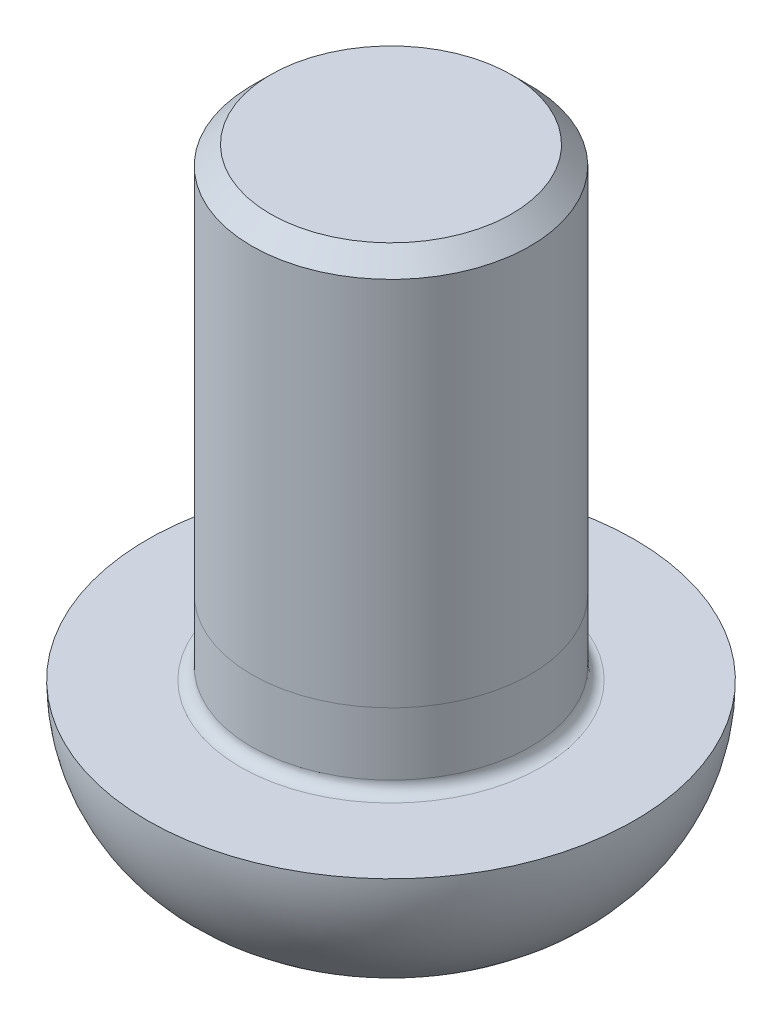
ISO-10303-21;
HEADER;
FILE_DESCRIPTION(('STEP AP214'),'2;1');
FILE_NAME('part.step','',(''),(''),'','','');
FILE_SCHEMA(('AUTOMOTIVE_DESIGN { 1 0 10303 214 1 1 1 1 }'));
ENDSEC;
DATA;
#1=APPLICATION_CONTEXT('core data for automotive mechanical design processes');
#2=APPLICATION_PROTOCOL_DEFINITION('international standard','automotive_design',2000,#1);
#3=PRODUCT_CONTEXT('',#1,'mechanical');
#4=PRODUCT('Part','Part','',(#3));
#5=PRODUCT_RELATED_PRODUCT_CATEGORY('part','',(#4));
#6=PRODUCT_DEFINITION_FORMATION('','',#4);
#7=PRODUCT_DEFINITION_CONTEXT('part definition',#1,'design');
#8=PRODUCT_DEFINITION('design','',#6,#7);
#9=PRODUCT_DEFINITION_SHAPE('','',#8);
#10=(LENGTH_UNIT() NAMED_UNIT(*) SI_UNIT(.MILLI.,.METRE.));
#11=(NAMED_UNIT(*) PLANE_ANGLE_UNIT() SI_UNIT($,.RADIAN.));
#12=(NAMED_UNIT(*) SI_UNIT($,.STERADIAN.) SOLID_ANGLE_UNIT());
#13=UNCERTAINTY_MEASURE_WITH_UNIT(LENGTH_MEASURE(1.E-05),#10,'distance_accuracy_value','');
#14=(GEOMETRIC_REPRESENTATION_CONTEXT(3) GLOBAL_UNCERTAINTY_ASSIGNED_CONTEXT((#13)) GLOBAL_UNIT_ASSIGNED_CONTEXT((#10,
#11,#12)) REPRESENTATION_CONTEXT('',''));
#15=CARTESIAN_POINT('',(0.,0.,0.));
#16=DIRECTION('',(0.,0.,1.));
#17=DIRECTION('',(1.,0.,0.));
#18=AXIS2_PLACEMENT_3D('',#15,#16,#17);
#19=CARTESIAN_POINT('',(0.,0.,0.));
#20=DIRECTION('',(0.,1.,0.));
#21=DIRECTION('',(0.,0.,1.));
#22=AXIS2_PLACEMENT_3D('',#19,#20,#21);
#23=CYLINDRICAL_SURFACE('',#22,3.);
#24=CARTESIAN_POINT('',(0.,9.6,0.));
#25=DIRECTION('',(0.,1.,0.));
#26=DIRECTION('',(0.,0.,1.));
#27=AXIS2_PLACEMENT_3D('',#24,#25,#26);
#28=CIRCLE('',#27,3.);
#29=CARTESIAN_POINT('',(0.,9.6,3.));
#30=VERTEX_POINT('',#29);
#31=EDGE_CURVE('E28',#30,#30,#28,.F.);
#32=ORIENTED_EDGE('',*,*,#31,.T.);
#33=EDGE_LOOP('',(#32));
#34=FACE_BOUND('',#33,.T.);
#35=CARTESIAN_POINT('',(0.,1.6,0.));
#36=DIRECTION('',(0.,1.,0.));
#37=DIRECTION('',(0.,0.,1.));
#38=AXIS2_PLACEMENT_3D('',#35,#36,#37);
#39=CIRCLE('',#38,3.);
#40=CARTESIAN_POINT('',(0.,1.6,3.));
#41=VERTEX_POINT('',#40);
#42=EDGE_CURVE('E11',#41,#41,#39,.T.);
#43=ORIENTED_EDGE('',*,*,#42,.T.);
#44=EDGE_LOOP('',(#43));
#45=FACE_BOUND('',#44,.T.);
#46=ADVANCED_FACE('F18',(#34,#45),#23,.T.);
#47=ORIENTED_EDGE('',*,*,#42,.F.);
#48=EDGE_LOOP('',(#47));
#49=FACE_BOUND('',#48,.T.);
#50=CARTESIAN_POINT('',(0.,0.25,0.));
#51=DIRECTION('',(0.,1.,0.));
#52=DIRECTION('',(0.,0.,1.));
#53=AXIS2_PLACEMENT_3D('',#50,#51,#52);
#54=CIRCLE('',#53,3.);
#55=CARTESIAN_POINT('',(0.,0.25,3.));
#56=VERTEX_POINT('',#55);
#57=EDGE_CURVE('E288',#56,#56,#54,.T.);
#58=ORIENTED_EDGE('',*,*,#57,.T.);
#59=EDGE_LOOP('',(#58));
#60=FACE_BOUND('',#59,.T.);
#61=ADVANCED_FACE('F201',(#49,#60),#23,.T.);
#62=CARTESIAN_POINT('',(5.25,0.,0.));
#63=DIRECTION('',(0.,1.,0.));
#64=DIRECTION('',(0.,0.,1.));
#65=AXIS2_PLACEMENT_3D('',#62,#63,#64);
#66=PLANE('',#65);
#67=CARTESIAN_POINT('',(0.,0.,0.));
#68=DIRECTION('',(0.,1.,0.));
#69=DIRECTION('',(0.,0.,1.));
#70=AXIS2_PLACEMENT_3D('',#67,#68,#69);
#71=CIRCLE('',#70,3.25);
#72=CARTESIAN_POINT('',(0.,0.,3.25));
#73=VERTEX_POINT('',#72);
#74=EDGE_CURVE('E285',#73,#73,#71,.F.);
#75=ORIENTED_EDGE('',*,*,#74,.T.);
#76=EDGE_LOOP('',(#75));
#77=FACE_BOUND('',#76,.T.);
#78=CARTESIAN_POINT('',(0.,0.,0.));
#79=DIRECTION('',(0.,1.,0.));
#80=DIRECTION('',(0.,0.,1.));
#81=AXIS2_PLACEMENT_3D('',#78,#79,#80);
#82=CIRCLE('',#81,5.25);
#83=CARTESIAN_POINT('',(0.,0.,5.25));
#84=VERTEX_POINT('',#83);
#85=EDGE_CURVE('E112',#84,#84,#82,.T.);
#86=ORIENTED_EDGE('',*,*,#85,.T.);
#87=EDGE_LOOP('',(#86));
#88=FACE_BOUND('',#87,.T.);
#89=ADVANCED_FACE('F206',(#77,#88),#66,.T.);
#90=CARTESIAN_POINT('',(0.,10.,0.));
#91=DIRECTION('',(0.,1.,0.));
#92=DIRECTION('',(0.,0.,1.));
#93=AXIS2_PLACEMENT_3D('',#90,#91,#92);
#94=PLANE('',#93);
#95=CARTESIAN_POINT('',(0.,10.,0.));
#96=DIRECTION('',(0.,1.,0.));
#97=DIRECTION('',(0.,0.,1.));
#98=AXIS2_PLACEMENT_3D('',#95,#96,#97);
#99=CIRCLE('',#98,2.6);
#100=CARTESIAN_POINT('',(0.,10.,2.6));
#101=VERTEX_POINT('',#100);
#102=EDGE_CURVE('E294',#101,#101,#99,.T.);
#103=ORIENTED_EDGE('',*,*,#102,.T.);
#104=EDGE_LOOP('',(#103));
#105=FACE_BOUND('',#104,.T.);
#106=ADVANCED_FACE('F235',(#105),#94,.T.);
#107=CARTESIAN_POINT('',(0.,0.25,0.));
#108=DIRECTION('',(0.,1.,0.));
#109=DIRECTION('',(0.,0.,1.));
#110=AXIS2_PLACEMENT_3D('',#107,#108,#109);
#111=TOROIDAL_SURFACE('',#110,3.25,0.25);
#112=ORIENTED_EDGE('',*,*,#74,.F.);
#113=EDGE_LOOP('',(#112));
#114=FACE_BOUND('',#113,.T.);
#115=ORIENTED_EDGE('',*,*,#57,.F.);
#116=EDGE_LOOP('',(#115));
#117=FACE_BOUND('',#116,.T.);
#118=ADVANCED_FACE('F274',(#114,#117),#111,.F.);
#119=CARTESIAN_POINT('',(0.,10.,0.));
#120=DIRECTION('',(0.,-1.,0.));
#121=DIRECTION('',(0.,0.,-1.));
#122=AXIS2_PLACEMENT_3D('',#119,#120,#121);
#123=CONICAL_SURFACE('',#122,2.6,0.785398163397449);
#124=ORIENTED_EDGE('',*,*,#31,.F.);
#125=EDGE_LOOP('',(#124));
#126=FACE_BOUND('',#125,.T.);
#127=ORIENTED_EDGE('',*,*,#102,.F.);
#128=EDGE_LOOP('',(#127));
#129=FACE_BOUND('',#128,.T.);
#130=ADVANCED_FACE('F21',(#126,#129),#123,.T.);
#131=CARTESIAN_POINT('',(0.,0.,0.));
#132=DIRECTION('',(0.,-1.,0.));
#133=DIRECTION('',(0.,0.,-1.));
#134=AXIS2_PLACEMENT_3D('',#131,#132,#133);
#135=DEGENERATE_TOROIDAL_SURFACE('',#134,1.67165208586472,3.57834791413527,.T.);
#136=ORIENTED_EDGE('',*,*,#85,.F.);
#137=EDGE_LOOP('',(#136));
#138=FACE_BOUND('',#137,.T.);
#139=CARTESIAN_POINT('',(0.,-3.3,0.));
#140=DIRECTION('',(0.,-1.,0.));
#141=DIRECTION('',(0.,0.,-1.));
#142=AXIS2_PLACEMENT_3D('',#139,#140,#141);
#143=CIRCLE('',#142,3.05533333333333);
#144=CARTESIAN_POINT('',(0.,-3.3,-3.05533333333333));
#145=VERTEX_POINT('',#144);
#146=EDGE_CURVE('E128',#145,#145,#143,.T.);
#147=ORIENTED_EDGE('',*,*,#146,.F.);
#148=EDGE_LOOP('',(#147));
#149=FACE_BOUND('',#148,.T.);
#150=ADVANCED_FACE('F153',(#138,#149),#135,.T.);
#151=CARTESIAN_POINT('',(0.,0.391673276442843,0.));
#152=DIRECTION('',(0.,-1.,0.));
#153=DIRECTION('',(0.,0.,-1.));
#154=AXIS2_PLACEMENT_3D('',#151,#152,#153);
#155=CONICAL_SURFACE('',#154,0.,1.0471975511966);
#156=CARTESIAN_POINT('',(0.,0.391673276442843,0.));
#157=VERTEX_POINT('',#156);
#158=VERTEX_LOOP('',#157);
#159=FACE_BOUND('',#158,.T.);
#160=CARTESIAN_POINT('',(-1.15458506832542,-0.94172672855691,2.0002));
#161=CARTESIAN_POINT('',(-1.20532911262018,-0.91241679803709,1.91230873709994));
#162=CARTESIAN_POINT('',(-1.2565111744778,-0.885760113916877,1.82365880552641));
#163=CARTESIAN_POINT('',(-1.3597616401932,-0.839229752957131,1.6448237530022));
#164=CARTESIAN_POINT('',(-1.41183187919146,-0.819372538319189,1.55463545349496));
#165=CARTESIAN_POINT('',(-1.51532701829184,-0.788460725959663,1.37537661423669));
#166=CARTESIAN_POINT('',(-1.56673599086579,-0.777200413534941,1.28633366177369));
#167=CARTESIAN_POINT('',(-1.66979593505374,-0.763755924531053,1.10782860221495));
#168=CARTESIAN_POINT('',(-1.72144653186531,-0.76156061688988,1.01836714429604));
#169=CARTESIAN_POINT('',(-1.81796535054794,-0.766118251267061,0.851191646451196));
#170=CARTESIAN_POINT('',(-1.86284799277603,-0.771752136623426,0.773452629734213));
#171=CARTESIAN_POINT('',(-1.95232085557725,-0.789611157197239,0.618481085463865));
#172=CARTESIAN_POINT('',(-1.99691076648955,-0.80184239795985,0.5412490942588));
#173=CARTESIAN_POINT('',(-2.08656822922817,-0.832420698804021,0.385957813517798));
#174=CARTESIAN_POINT('',(-2.13162442866767,-0.850897429002127,0.30791818689262));
#175=CARTESIAN_POINT('',(-2.221064675979,-0.892832780149267,0.153003134307866));
#176=CARTESIAN_POINT('',(-2.26544987045196,-0.916281542428725,0.0761257223768806));
#177=CARTESIAN_POINT('',(-2.30951654681234,-0.941726728556909,-0.000200000000000504));
#178=B_SPLINE_CURVE_WITH_KNOTS('',3,(#160,#161,#162,#163,#164,#165,#166,#167,#168,#169,#170,
#171,#172,#173,#174,#175,#176,#177),.UNSPECIFIED.,.F.,.F.,(4,2,2,2,2,2,2,2,4),(0.,
0.317031824695612,0.634825876346566,0.944753967652639,1.25430138000372,1.52387047293094,
1.79368946861028,2.06949491027634,2.34475850821472),.UNSPECIFIED.);
#179=CARTESIAN_POINT('',(-1.15470053837926,-0.941660056890493,2.));
#180=VERTEX_POINT('',#179);
#181=CARTESIAN_POINT('',(-2.3094010767585,-0.941660056890492,0.));
#182=VERTEX_POINT('',#181);
#183=EDGE_CURVE('E239',#180,#182,#178,.T.);
#184=ORIENTED_EDGE('',*,*,#183,.T.);
#185=CARTESIAN_POINT('',(-2.30951654681234,-0.941726728556909,0.000200000000000068));
#186=CARTESIAN_POINT('',(-2.25877250251757,-0.912416798037087,-0.0876912629000592));
#187=CARTESIAN_POINT('',(-2.20759044065995,-0.885760113916874,-0.17634119447359));
#188=CARTESIAN_POINT('',(-2.10433997494456,-0.839229752957128,-0.355176246997801));
#189=CARTESIAN_POINT('',(-2.0522697359463,-0.819372538319187,-0.445364546505036));
#190=CARTESIAN_POINT('',(-1.94877459684592,-0.78846072595966,-0.624623385763305));
#191=CARTESIAN_POINT('',(-1.89736562427197,-0.777200413534938,-0.713666338226303));
#192=CARTESIAN_POINT('',(-1.79430568008402,-0.76375592453105,-0.892171397785043));
#193=CARTESIAN_POINT('',(-1.74265508327244,-0.761560616889878,-0.981632855703958));
#194=CARTESIAN_POINT('',(-1.64613626458981,-0.766118251267059,-1.1488083535488));
#195=CARTESIAN_POINT('',(-1.60125362236172,-0.771752136623423,-1.22654737026578));
#196=CARTESIAN_POINT('',(-1.5117807595605,-0.789611157197236,-1.38151891453613));
#197=CARTESIAN_POINT('',(-1.46719084864821,-0.801842397959847,-1.4587509057412));
#198=CARTESIAN_POINT('',(-1.37753338590959,-0.832420698804018,-1.6140421864822));
#199=CARTESIAN_POINT('',(-1.33247718647008,-0.850897429002124,-1.69208181310738));
#200=CARTESIAN_POINT('',(-1.24303693915875,-0.892832780149265,-1.84699686569214));
#201=CARTESIAN_POINT('',(-1.19865174468579,-0.916281542428723,-1.92387427762312));
#202=CARTESIAN_POINT('',(-1.15458506832541,-0.94172672855691,-2.0002));
#203=B_SPLINE_CURVE_WITH_KNOTS('',3,(#185,#186,#187,#188,#189,#190,#191,#192,#193,#194,#195,
#196,#197,#198,#199,#200,#201,#202),.UNSPECIFIED.,.F.,.F.,(4,2,2,2,2,2,2,2,4),(0.,
0.317031824695611,0.634825876346565,0.944753967652637,1.25430138000371,1.52387047293094,
1.79368946861029,2.06949491027634,2.34475850821473),.UNSPECIFIED.);
#204=CARTESIAN_POINT('',(-1.15470053837925,-0.941660056890493,-2.));
#205=VERTEX_POINT('',#204);
#206=EDGE_CURVE('E217',#182,#205,#203,.T.);
#207=ORIENTED_EDGE('',*,*,#206,.T.);
#208=CARTESIAN_POINT('',(-3.97107242292986,-2.17538835040825,-2.));
#209=CARTESIAN_POINT('',(-3.87868247277526,-2.12775059746127,-2.));
#210=CARTESIAN_POINT('',(-3.7861588003778,-2.08037372958414,-2.));
#211=CARTESIAN_POINT('',(-3.60078450821548,-1.98626017948102,-2.00000000000001));
#212=CARTESIAN_POINT('',(-3.50793388259158,-1.93952350880157,-2.00000000000001));
#213=CARTESIAN_POINT('',(-3.22850900761148,-1.80030535880982,-2.));
#214=CARTESIAN_POINT('',(-3.04135761037277,-1.70896924768975,-2.));
#215=CARTESIAN_POINT('',(-2.75397555619272,-1.5731154540905,-2.));
#216=CARTESIAN_POINT('',(-2.65454530475032,-1.52690595800733,-2.));
#217=CARTESIAN_POINT('',(-2.45492785759602,-1.43615536855376,-2.));
#218=CARTESIAN_POINT('',(-2.3547406899451,-1.39161421369455,-2.));
#219=CARTESIAN_POINT('',(-2.15350213975009,-1.30470652650298,-2.));
#220=CARTESIAN_POINT('',(-2.05245137959688,-1.26233856057289,-2.));
#221=CARTESIAN_POINT('',(-1.84919030086332,-1.18039650371769,-2.));
#222=CARTESIAN_POINT('',(-1.74697972173689,-1.14082305558609,-2.));
#223=CARTESIAN_POINT('',(-1.52508206994959,-1.05946514421621,-2.));
#224=CARTESIAN_POINT('',(-1.40516322629618,-1.01830385306277,-2.));
#225=CARTESIAN_POINT('',(-1.16321218809007,-0.942832074454553,-2.));
#226=CARTESIAN_POINT('',(-1.04118108489843,-0.908518157540933,-2.));
#227=CARTESIAN_POINT('',(-0.797191699347654,-0.849762632395411,-2.));
#228=CARTESIAN_POINT('',(-0.675277439673617,-0.825143320410585,-2.));
#229=CARTESIAN_POINT('',(-0.42968597996561,-0.78740551194056,-2.));
#230=CARTESIAN_POINT('',(-0.306009864773069,-0.774280224898857,-2.));
#231=CARTESIAN_POINT('',(-0.0561948130021474,-0.761222818220792,-2.));
#232=CARTESIAN_POINT('',(0.0699543957642671,-0.761477523372083,-2.));
#233=CARTESIAN_POINT('',(0.321490472578919,-0.775609005131668,-2.));
#234=CARTESIAN_POINT('',(0.446877078128915,-0.789490231676833,-2.));
#235=CARTESIAN_POINT('',(0.698268076239721,-0.829339251040338,-2.));
#236=CARTESIAN_POINT('',(0.824232704616094,-0.855548309192251,-1.99999999999999));
#237=CARTESIAN_POINT('',(1.07382197335698,-0.917314019236256,-2.));
#238=CARTESIAN_POINT('',(1.19744582529425,-0.952873762658447,-2.));
#239=CARTESIAN_POINT('',(1.43877717975325,-1.02962266424125,-2.));
#240=CARTESIAN_POINT('',(1.55655051066925,-1.07060890554915,-2.));
#241=CARTESIAN_POINT('',(1.79038315988528,-1.15724391469459,-1.99999999999999));
#242=CARTESIAN_POINT('',(1.90644203337208,-1.20289386902531,-1.99999999999999));
#243=CARTESIAN_POINT('',(2.13727613898438,-1.29764227315016,-1.99999999999999));
#244=CARTESIAN_POINT('',(2.25204987258198,-1.3467443434052,-1.99999999999999));
#245=CARTESIAN_POINT('',(2.48048565996255,-1.44747310577301,-1.99999999999999));
#246=CARTESIAN_POINT('',(2.59414765093807,-1.499099939544,-1.99999999999999));
#247=CARTESIAN_POINT('',(2.81406706680889,-1.60122748447267,-1.99999999999999));
#248=CARTESIAN_POINT('',(2.92037405177845,-1.65162191070667,-1.99999999999999));
#249=CARTESIAN_POINT('',(3.1323563665145,-1.75372845058398,-1.99999999999999));
#250=CARTESIAN_POINT('',(3.23803167473215,-1.80544060886685,-1.99999999999999));
#251=CARTESIAN_POINT('',(3.44851064882037,-1.90972549113419,-1.99999999999999));
#252=CARTESIAN_POINT('',(3.55331605390046,-1.96229471304186,-1.99999999999999));
#253=CARTESIAN_POINT('',(3.7624942913087,-2.06826501338616,-1.99999999999999));
#254=CARTESIAN_POINT('',(3.86686716058578,-2.12166601883339,-1.99999999999999));
#255=CARTESIAN_POINT('',(3.97107242292986,-2.17538835040825,-2.));
#256=B_SPLINE_CURVE_WITH_KNOTS('',3,(#208,#209,#210,#211,#212,#213,#214,#215,#216,#217,#218,
#219,#220,#221,#222,#223,#224,#225,#226,#227,#228,#229,#230,#231,#232,#233,#234,#235,#236,#237,
#238,#239,#240,#241,#242,#243,#244,#245,#246,#247,#248,#249,#250,#251,#252,#253,#254,#255),
.UNSPECIFIED.,.F.,.F.,(4,2,2,2,2,2,2,2,2,2,2,2,2,2,2,2,2,2,2,2,2,2,2,4),(0.,0.311842723826934,
0.62369106463389,1.24838758455579,1.57730682351192,1.90621392778465,2.23490119378745,
2.56366381964157,2.94387628317646,3.32389783939494,3.69658721194995,4.06905625447051,
4.44672744508521,4.82452201071132,5.21003920255201,5.59568401496473,5.96965872681082,
6.34372881945369,6.71819725104189,7.09268671728378,7.44561614609446,7.79855754669429,
8.15030525169476,8.50202226264185),.UNSPECIFIED.);
#257=CARTESIAN_POINT('',(1.15470053837925,-0.941660056890493,-2.));
#258=VERTEX_POINT('',#257);
#259=EDGE_CURVE('E109',#205,#258,#256,.T.);
#260=ORIENTED_EDGE('',*,*,#259,.T.);
#261=CARTESIAN_POINT('',(1.15458506832542,-0.941726728556909,-2.0002));
#262=CARTESIAN_POINT('',(1.20532911262018,-0.912416798037089,-1.91230873709994));
#263=CARTESIAN_POINT('',(1.2565111744778,-0.885760113916877,-1.82365880552641));
#264=CARTESIAN_POINT('',(1.3597616401932,-0.839229752957131,-1.6448237530022));
#265=CARTESIAN_POINT('',(1.41183187919145,-0.819372538319189,-1.55463545349496));
#266=CARTESIAN_POINT('',(1.51532701829183,-0.788460725959662,-1.37537661423669));
#267=CARTESIAN_POINT('',(1.56673599086579,-0.777200413534941,-1.2863336617737));
#268=CARTESIAN_POINT('',(1.66979593505373,-0.763755924531052,-1.10782860221496));
#269=CARTESIAN_POINT('',(1.72144653186531,-0.761560616889878,-1.01836714429604));
#270=CARTESIAN_POINT('',(1.81796535054794,-0.766118251267059,-0.851191646451198));
#271=CARTESIAN_POINT('',(1.86284799277603,-0.771752136623424,-0.773452629734215));
#272=CARTESIAN_POINT('',(1.95232085557725,-0.789611157197239,-0.618481085463866));
#273=CARTESIAN_POINT('',(1.99691076648955,-0.80184239795985,-0.5412490942588));
#274=CARTESIAN_POINT('',(2.08656822922816,-0.832420698804021,-0.385957813517798));
#275=CARTESIAN_POINT('',(2.13162442866767,-0.850897429002127,-0.307918186892619));
#276=CARTESIAN_POINT('',(2.221064675979,-0.892832780149267,-0.153003134307863));
#277=CARTESIAN_POINT('',(2.26544987045196,-0.916281542428725,-0.0761257223768776));
#278=CARTESIAN_POINT('',(2.30951654681234,-0.941726728556909,0.000200000000003825));
#279=B_SPLINE_CURVE_WITH_KNOTS('',3,(#261,#262,#263,#264,#265,#266,#267,#268,#269,#270,#271,
#272,#273,#274,#275,#276,#277,#278),.UNSPECIFIED.,.F.,.F.,(4,2,2,2,2,2,2,2,4),(0.,
0.31703182469561,0.634825876346565,0.944753967652637,1.25430138000371,1.52387047293094,
1.79368946861028,2.06949491027634,2.34475850821473),.UNSPECIFIED.);
#280=CARTESIAN_POINT('',(2.3094010767585,-0.941660056890493,0.));
#281=VERTEX_POINT('',#280);
#282=EDGE_CURVE('E263',#258,#281,#279,.T.);
#283=ORIENTED_EDGE('',*,*,#282,.T.);
#284=CARTESIAN_POINT('',(2.30951654681234,-0.941726728556909,-0.000199999999996057));
#285=CARTESIAN_POINT('',(2.25877250251757,-0.912416798037088,0.0876912629000633));
#286=CARTESIAN_POINT('',(2.20759044065995,-0.885760113916875,0.176341194473594));
#287=CARTESIAN_POINT('',(2.10433997494456,-0.839229752957129,0.355176246997805));
#288=CARTESIAN_POINT('',(2.0522697359463,-0.819372538319187,0.445364546505039));
#289=CARTESIAN_POINT('',(1.94877459684592,-0.78846072595966,0.624623385763309));
#290=CARTESIAN_POINT('',(1.89736562427197,-0.777200413534938,0.713666338226308));
#291=CARTESIAN_POINT('',(1.79430568008402,-0.76375592453105,0.892171397785046));
#292=CARTESIAN_POINT('',(1.74265508327243,-0.761560616889878,0.98163285570396));
#293=CARTESIAN_POINT('',(1.64613626458981,-0.766118251267059,1.1488083535488));
#294=CARTESIAN_POINT('',(1.60125362236172,-0.771752136623423,1.22654737026579));
#295=CARTESIAN_POINT('',(1.5117807595605,-0.789611157197236,1.38151891453614));
#296=CARTESIAN_POINT('',(1.46719084864821,-0.801842397959848,1.4587509057412));
#297=CARTESIAN_POINT('',(1.37753338590959,-0.832420698804018,1.6140421864822));
#298=CARTESIAN_POINT('',(1.33247718647008,-0.850897429002125,1.69208181310738));
#299=CARTESIAN_POINT('',(1.24303693915875,-0.892832780149265,1.84699686569214));
#300=CARTESIAN_POINT('',(1.19865174468579,-0.916281542428723,1.92387427762312));
#301=CARTESIAN_POINT('',(1.1545850683254,-0.941726728556909,2.0002));
#302=B_SPLINE_CURVE_WITH_KNOTS('',3,(#284,#285,#286,#287,#288,#289,#290,#291,#292,#293,#294,
#295,#296,#297,#298,#299,#300,#301),.UNSPECIFIED.,.F.,.F.,(4,2,2,2,2,2,2,2,4),(0.,
0.317031824695611,0.634825876346565,0.944753967652638,1.25430138000371,1.52387047293094,
1.79368946861028,2.06949491027634,2.34475850821473),.UNSPECIFIED.);
#303=CARTESIAN_POINT('',(1.15470053837924,-0.941660056890492,2.));
#304=VERTEX_POINT('',#303);
#305=EDGE_CURVE('E257',#281,#304,#302,.T.);
#306=ORIENTED_EDGE('',*,*,#305,.T.);
#307=CARTESIAN_POINT('',(3.97107242292986,-2.17538835040825,2.));
#308=CARTESIAN_POINT('',(3.87868247277525,-2.12775059746126,2.));
#309=CARTESIAN_POINT('',(3.7861588003778,-2.08037372958414,2.00000000000001));
#310=CARTESIAN_POINT('',(3.60078450821547,-1.98626017948102,2.00000000000001));
#311=CARTESIAN_POINT('',(3.50793388259158,-1.93952350880157,2.00000000000001));
#312=CARTESIAN_POINT('',(3.22850900761148,-1.80030535880982,2.));
#313=CARTESIAN_POINT('',(3.04135761037276,-1.70896924768974,2.));
#314=CARTESIAN_POINT('',(2.75397555619272,-1.5731154540905,2.));
#315=CARTESIAN_POINT('',(2.65454530475031,-1.52690595800733,2.));
#316=CARTESIAN_POINT('',(2.45492785759602,-1.43615536855376,2.));
#317=CARTESIAN_POINT('',(2.35474068994509,-1.39161421369454,2.));
#318=CARTESIAN_POINT('',(2.15350213975008,-1.30470652650297,2.));
#319=CARTESIAN_POINT('',(2.05245137959687,-1.26233856057289,2.));
#320=CARTESIAN_POINT('',(1.84919030086332,-1.18039650371768,2.));
#321=CARTESIAN_POINT('',(1.74697972173688,-1.14082305558609,2.));
#322=CARTESIAN_POINT('',(1.52508206994959,-1.05946514421621,2.));
#323=CARTESIAN_POINT('',(1.40516322629617,-1.01830385306277,2.));
#324=CARTESIAN_POINT('',(1.16321218809006,-0.942832074454551,2.));
#325=CARTESIAN_POINT('',(1.04118108489842,-0.90851815754093,2.));
#326=CARTESIAN_POINT('',(0.797191699347647,-0.849762632395409,2.));
#327=CARTESIAN_POINT('',(0.675277439673609,-0.825143320410583,2.));
#328=CARTESIAN_POINT('',(0.429685979965601,-0.787405511940558,2.));
#329=CARTESIAN_POINT('',(0.30600986477306,-0.774280224898856,2.));
#330=CARTESIAN_POINT('',(0.0561948130021376,-0.761222818220792,2.));
#331=CARTESIAN_POINT('',(-0.0699543957642771,-0.761477523372083,2.));
#332=CARTESIAN_POINT('',(-0.32149047257893,-0.775609005131668,2.));
#333=CARTESIAN_POINT('',(-0.446877078128926,-0.789490231676834,2.));
#334=CARTESIAN_POINT('',(-0.698268076239732,-0.82933925104034,2.));
#335=CARTESIAN_POINT('',(-0.824232704616105,-0.855548309192252,1.99999999999999));
#336=CARTESIAN_POINT('',(-1.07382197335699,-0.917314019236258,2.));
#337=CARTESIAN_POINT('',(-1.19744582529427,-0.95287376265845,2.));
#338=CARTESIAN_POINT('',(-1.43877717975326,-1.02962266424125,2.));
#339=CARTESIAN_POINT('',(-1.55655051066926,-1.07060890554915,1.99999999999999));
#340=CARTESIAN_POINT('',(-1.79038315988529,-1.15724391469459,1.99999999999999));
#341=CARTESIAN_POINT('',(-1.90644203337209,-1.20289386902531,1.99999999999999));
#342=CARTESIAN_POINT('',(-2.13727613898438,-1.29764227315017,1.99999999999999));
#343=CARTESIAN_POINT('',(-2.25204987258199,-1.3467443434052,1.99999999999999));
#344=CARTESIAN_POINT('',(-2.48048565996256,-1.44747310577301,1.99999999999999));
#345=CARTESIAN_POINT('',(-2.59414765093807,-1.499099939544,1.99999999999999));
#346=CARTESIAN_POINT('',(-2.81406706680889,-1.60122748447267,1.99999999999999));
#347=CARTESIAN_POINT('',(-2.92037405177846,-1.65162191070667,1.99999999999999));
#348=CARTESIAN_POINT('',(-3.1323563665145,-1.75372845058398,1.99999999999999));
#349=CARTESIAN_POINT('',(-3.23803167473215,-1.80544060886684,1.99999999999999));
#350=CARTESIAN_POINT('',(-3.44851064882038,-1.90972549113419,1.99999999999999));
#351=CARTESIAN_POINT('',(-3.55331605390046,-1.96229471304186,1.99999999999999));
#352=CARTESIAN_POINT('',(-3.7624942913087,-2.06826501338616,1.99999999999999));
#353=CARTESIAN_POINT('',(-3.86686716058578,-2.12166601883338,1.99999999999999));
#354=CARTESIAN_POINT('',(-3.97107242292986,-2.17538835040825,2.));
#355=B_SPLINE_CURVE_WITH_KNOTS('',3,(#307,#308,#309,#310,#311,#312,#313,#314,#315,#316,#317,
#318,#319,#320,#321,#322,#323,#324,#325,#326,#327,#328,#329,#330,#331,#332,#333,#334,#335,#336,
#337,#338,#339,#340,#341,#342,#343,#344,#345,#346,#347,#348,#349,#350,#351,#352,#353,#354),
.UNSPECIFIED.,.F.,.F.,(4,2,2,2,2,2,2,2,2,2,2,2,2,2,2,2,2,2,2,2,2,2,2,4),(0.,0.311842723826934,
0.623691064633889,1.24838758455579,1.57730682351192,1.90621392778465,2.23490119378744,
2.56366381964157,2.94387628317646,3.32389783939494,3.69658721194995,4.06905625447051,
4.44672744508521,4.82452201071133,5.21003920255201,5.59568401496474,5.96965872681082,
6.34372881945369,6.71819725104189,7.09268671728378,7.44561614609446,7.79855754669429,
8.15030525169475,8.50202226264184),.UNSPECIFIED.);
#356=EDGE_CURVE('E249',#304,#180,#355,.T.);
#357=ORIENTED_EDGE('',*,*,#356,.T.);
#358=EDGE_LOOP('',(#184,#207,#260,#283,#306,#357));
#359=FACE_BOUND('',#358,.T.);
#360=ADVANCED_FACE('F186',(#159,#359),#155,.F.);
#361=CARTESIAN_POINT('',(-1.15470053837925,16.6346432122574,-2.));
#362=DIRECTION('',(0.,0.,-1.));
#363=DIRECTION('',(-1.,0.,0.));
#364=AXIS2_PLACEMENT_3D('',#361,#362,#363);
#365=PLANE('',#364);
#366=CARTESIAN_POINT('',(3.54576846416073,-3.77200034906827,-2.));
#367=CARTESIAN_POINT('',(3.46032331155691,-3.75206057830072,-1.99999999999999));
#368=CARTESIAN_POINT('',(3.37484047761441,-3.73228232054218,-1.99999999999999));
#369=CARTESIAN_POINT('',(3.20378355240315,-3.69311847013324,-1.99999999999999));
#370=CARTESIAN_POINT('',(3.11820945972395,-3.67373288364707,-1.99999999999999));
#371=CARTESIAN_POINT('',(2.86130062428642,-3.61626384835692,-1.99999999999999));
#372=CARTESIAN_POINT('',(2.68980910024909,-3.57887512354549,-1.99999999999999));
#373=CARTESIAN_POINT('',(2.34458511529228,-3.50643853365192,-1.99999999999999));
#374=CARTESIAN_POINT('',(2.1708470844132,-3.47141698135254,-1.99999999999999));
#375=CARTESIAN_POINT('',(1.82256095831907,-3.40547978469486,-1.99999999999999));
#376=CARTESIAN_POINT('',(1.64801278540453,-3.37456454295519,-1.99999999999999));
#377=CARTESIAN_POINT('',(1.30271990845848,-3.31969790886641,-1.99999999999999));
#378=CARTESIAN_POINT('',(1.13200256296387,-3.29557843402185,-2.));
#379=CARTESIAN_POINT('',(0.789571689000483,-3.25587323584062,-2.));
#380=CARTESIAN_POINT('',(0.6178584998347,-3.24028476073478,-2.));
#381=CARTESIAN_POINT('',(0.36019540394543,-3.22525401912313,-2.));
#382=CARTESIAN_POINT('',(0.274483715684513,-3.22163460627376,-2.));
#383=CARTESIAN_POINT('',(0.102984480205782,-3.21731952917178,-2.));
#384=CARTESIAN_POINT('',(0.0171969334570651,-3.21662384696397,-2.));
#385=CARTESIAN_POINT('',(-0.15435587366281,-3.21819853237707,-2.));
#386=CARTESIAN_POINT('',(-0.240121132206929,-3.22046909420923,-2.));
#387=CARTESIAN_POINT('',(-0.411526390365097,-3.22785312413437,-2.));
#388=CARTESIAN_POINT('',(-0.497166389972947,-3.23296659236802,-2.));
#389=CARTESIAN_POINT('',(-0.706478859815856,-3.24865578967162,-2.));
#390=CARTESIAN_POINT('',(-0.830044925850673,-3.26065132303124,-2.));
#391=CARTESIAN_POINT('',(-1.07664653209346,-3.28907898341361,-2.));
#392=CARTESIAN_POINT('',(-1.19968208520209,-3.30551100192753,-2.));
#393=CARTESIAN_POINT('',(-1.44564714901042,-3.34186148211041,-2.));
#394=CARTESIAN_POINT('',(-1.5685749476794,-3.36179135163048,-2.));
#395=CARTESIAN_POINT('',(-1.81398159923811,-3.40425123821713,-2.));
#396=CARTESIAN_POINT('',(-1.93646042849967,-3.42678139015956,-2.));
#397=CARTESIAN_POINT('',(-2.18362417007064,-3.47428425653496,-2.));
#398=CARTESIAN_POINT('',(-2.30830103623406,-3.49929851142906,-2.));
#399=CARTESIAN_POINT('',(-2.55733999903382,-3.55084664791934,-2.));
#400=CARTESIAN_POINT('',(-2.68170209177125,-3.57738054824321,-2.));
#401=CARTESIAN_POINT('',(-2.92946437432295,-3.6314395789905,-2.));
#402=CARTESIAN_POINT('',(-3.05286599737638,-3.65895817166457,-2.));
#403=CARTESIAN_POINT('',(-3.29945995688185,-3.71487849715073,-2.));
#404=CARTESIAN_POINT('',(-3.4226523077504,-3.74328016629155,-2.));
#405=CARTESIAN_POINT('',(-3.54576846416072,-3.77200034906825,-2.));
#406=B_SPLINE_CURVE_WITH_KNOTS('',3,(#366,#367,#368,#369,#370,#371,#372,#373,#374,#375,#376,
#377,#378,#379,#380,#381,#382,#383,#384,#385,#386,#387,#388,#389,#390,#391,#392,#393,#394,#395,
#396,#397,#398,#399,#400,#401,#402,#403,#404,#405),.UNSPECIFIED.,.F.,.F.,(4,2,2,2,2,2,2,2,2,2,2,
2,2,2,2,2,2,2,2,4),(0.,0.263222401305707,0.526448931537519,1.05299375162049,1.58466125538442,
2.11638085006353,2.63348257137836,3.15041739730247,3.40773776741521,3.66505655727231,
3.92239219561216,4.17972784668617,4.55206097335712,4.92438499422329,5.29794667206535,
5.67152773515151,6.05299963584967,6.434476238713,6.81377086422973,7.1930382051055),.UNSPECIFIED.);
#407=CARTESIAN_POINT('',(1.15470053837925,-3.3,-2.));
#408=VERTEX_POINT('',#407);
#409=CARTESIAN_POINT('',(-1.15470053837925,-3.3,-2.));
#410=VERTEX_POINT('',#409);
#411=EDGE_CURVE('E88',#408,#410,#406,.T.);
#412=ORIENTED_EDGE('',*,*,#411,.F.);
#413=DIRECTION('',(0.,-1.,0.));
#414=VECTOR('',#413,1.);
#415=CARTESIAN_POINT('',(1.15470053837925,16.6346432122574,-2.));
#416=LINE('',#415,#414);
#417=EDGE_CURVE('E113',#258,#408,#416,.T.);
#418=ORIENTED_EDGE('',*,*,#417,.F.);
#419=ORIENTED_EDGE('',*,*,#259,.F.);
#420=DIRECTION('',(0.,-1.,0.));
#421=VECTOR('',#420,1.);
#422=CARTESIAN_POINT('',(-1.15470053837925,16.6346432122574,-2.));
#423=LINE('',#422,#421);
#424=EDGE_CURVE('E101',#205,#410,#423,.T.);
#425=ORIENTED_EDGE('',*,*,#424,.T.);
#426=EDGE_LOOP('',(#412,#418,#419,#425));
#427=FACE_BOUND('',#426,.T.);
#428=ADVANCED_FACE('F107',(#427),#365,.F.);
#429=CARTESIAN_POINT('',(1.15470053837925,16.6346432122574,-2.));
#430=DIRECTION('',(0.866025403784439,0.,-0.5));
#431=DIRECTION('',(-0.5,0.,-0.86602540378444));
#432=AXIS2_PLACEMENT_3D('',#429,#430,#431);
#433=PLANE('',#432);
#434=CARTESIAN_POINT('',(2.30951654681234,-3.30003094242808,0.000200000000003903));
#435=CARTESIAN_POINT('',(2.26155517902373,-3.28717294728116,-0.0828715258103692));
#436=CARTESIAN_POINT('',(2.21350683851658,-3.27549990930549,-0.166093692788128));
#437=CARTESIAN_POINT('',(2.11724043254796,-3.25499135519067,-0.332831998987827));
#438=CARTESIAN_POINT('',(2.06902230613691,-3.24615699216786,-0.416348243777553));
#439=CARTESIAN_POINT('',(1.97270874423801,-3.231841640157,-0.58316822644438));
#440=CARTESIAN_POINT('',(1.92461396034488,-3.22634357564339,-0.666470835726323));
#441=CARTESIAN_POINT('',(1.8283630443694,-3.21897122197136,-0.833182312470901));
#442=CARTESIAN_POINT('',(1.78020692596914,-3.21709623134525,-0.91659115623545));
#443=CARTESIAN_POINT('',(1.68389468916862,-3.21709623134525,-1.08340884376455));
#444=CARTESIAN_POINT('',(1.63573857076836,-3.21897122197136,-1.1668176875291));
#445=CARTESIAN_POINT('',(1.53948765479288,-3.22634357564339,-1.33352916427368));
#446=CARTESIAN_POINT('',(1.49139287089975,-3.231841640157,-1.41683177355562));
#447=CARTESIAN_POINT('',(1.39507930900085,-3.24615699216786,-1.58365175622245));
#448=CARTESIAN_POINT('',(1.3468611825898,-3.25499135519067,-1.66716800101217));
#449=CARTESIAN_POINT('',(1.25059477662118,-3.27549990930549,-1.83390630721187));
#450=CARTESIAN_POINT('',(1.20254643611403,-3.28717294728116,-1.91712847418963));
#451=CARTESIAN_POINT('',(1.15458506832542,-3.30003094242808,-2.0002));
#452=B_SPLINE_CURVE_WITH_KNOTS('',3,(#434,#435,#436,#437,#438,#439,#440,#441,#442,#443,#444,
#445,#446,#447,#448,#449,#450,#451),.UNSPECIFIED.,.F.,.F.,(4,2,2,2,2,2,2,2,4),(0.,
0.290357249044671,0.580832297293914,0.869807841095771,1.15872743038697,1.44764701967818,
1.73662256348003,2.02709761172928,2.31745486077395),.UNSPECIFIED.);
#453=CARTESIAN_POINT('',(2.30940107675851,-3.3,0.));
#454=VERTEX_POINT('',#453);
#455=EDGE_CURVE('E96',#454,#408,#452,.T.);
#456=ORIENTED_EDGE('',*,*,#455,.F.);
#457=DIRECTION('',(0.,-1.,0.));
#458=VECTOR('',#457,1.);
#459=CARTESIAN_POINT('',(2.3094010767585,16.6346432122574,0.));
#460=LINE('',#459,#458);
#461=EDGE_CURVE('E318',#281,#454,#460,.T.);
#462=ORIENTED_EDGE('',*,*,#461,.F.);
#463=ORIENTED_EDGE('',*,*,#282,.F.);
#464=ORIENTED_EDGE('',*,*,#417,.T.);
#465=EDGE_LOOP('',(#456,#462,#463,#464));
#466=FACE_BOUND('',#465,.T.);
#467=ADVANCED_FACE('F185',(#466),#433,.F.);
#468=CARTESIAN_POINT('',(2.3094010767585,16.6346432122574,0.));
#469=DIRECTION('',(0.866025403784437,0.,0.5));
#470=DIRECTION('',(0.5,0.,-0.866025403784438));
#471=AXIS2_PLACEMENT_3D('',#468,#469,#470);
#472=PLANE('',#471);
#473=CARTESIAN_POINT('',(1.1545850683254,-3.30003094242808,2.0002));
#474=CARTESIAN_POINT('',(1.20254643611402,-3.28717294728116,1.91712847418963));
#475=CARTESIAN_POINT('',(1.25059477662117,-3.27549990930549,1.83390630721187));
#476=CARTESIAN_POINT('',(1.34686118258979,-3.25499135519067,1.66716800101217));
#477=CARTESIAN_POINT('',(1.39507930900085,-3.24615699216786,1.58365175622245));
#478=CARTESIAN_POINT('',(1.49139287089975,-3.231841640157,1.41683177355562));
#479=CARTESIAN_POINT('',(1.53948765479288,-3.22634357564339,1.33352916427368));
#480=CARTESIAN_POINT('',(1.63573857076836,-3.21897122197136,1.1668176875291));
#481=CARTESIAN_POINT('',(1.68389468916862,-3.21709623134525,1.08340884376455));
#482=CARTESIAN_POINT('',(1.78020692596913,-3.21709623134525,0.916591156235454));
#483=CARTESIAN_POINT('',(1.82836304436939,-3.21897122197136,0.833182312470905));
#484=CARTESIAN_POINT('',(1.92461396034487,-3.22634357564339,0.666470835726328));
#485=CARTESIAN_POINT('',(1.972708744238,-3.231841640157,0.583168226444385));
#486=CARTESIAN_POINT('',(2.0690223061369,-3.24615699216786,0.416348243777557));
#487=CARTESIAN_POINT('',(2.11724043254796,-3.25499135519067,0.332831998987831));
#488=CARTESIAN_POINT('',(2.21350683851658,-3.27549990930549,0.166093692788133));
#489=CARTESIAN_POINT('',(2.26155517902373,-3.28717294728116,0.0828715258103747));
#490=CARTESIAN_POINT('',(2.30951654681234,-3.30003094242808,-0.00019999999999592));
#491=B_SPLINE_CURVE_WITH_KNOTS('',3,(#473,#474,#475,#476,#477,#478,#479,#480,#481,#482,#483,
#484,#485,#486,#487,#488,#489,#490),.UNSPECIFIED.,.F.,.F.,(4,2,2,2,2,2,2,2,4),(0.,
0.290357249044671,0.580832297293914,0.869807841095771,1.15872743038697,1.44764701967818,
1.73662256348003,2.02709761172928,2.31745486077395),.UNSPECIFIED.);
#492=CARTESIAN_POINT('',(1.15470053837925,-3.3,2.));
#493=VERTEX_POINT('',#492);
#494=EDGE_CURVE('E138',#493,#454,#491,.T.);
#495=ORIENTED_EDGE('',*,*,#494,.F.);
#496=DIRECTION('',(0.,-1.,0.));
#497=VECTOR('',#496,1.);
#498=CARTESIAN_POINT('',(1.15470053837924,16.6346432122574,2.));
#499=LINE('',#498,#497);
#500=EDGE_CURVE('E316',#304,#493,#499,.T.);
#501=ORIENTED_EDGE('',*,*,#500,.F.);
#502=ORIENTED_EDGE('',*,*,#305,.F.);
#503=ORIENTED_EDGE('',*,*,#461,.T.);
#504=EDGE_LOOP('',(#495,#501,#502,#503));
#505=FACE_BOUND('',#504,.T.);
#506=ADVANCED_FACE('F189',(#505),#472,.F.);
#507=CARTESIAN_POINT('',(1.15470053837924,16.6346432122574,2.));
#508=DIRECTION('',(0.,0.,1.));
#509=DIRECTION('',(1.,0.,0.));
#510=AXIS2_PLACEMENT_3D('',#507,#508,#509);
#511=PLANE('',#510);
#512=CARTESIAN_POINT('',(-3.54576846416073,-3.77200034906825,2.));
#513=CARTESIAN_POINT('',(-3.46032331155691,-3.7520605783007,1.99999999999999));
#514=CARTESIAN_POINT('',(-3.37484047761441,-3.73228232054217,1.99999999999999));
#515=CARTESIAN_POINT('',(-3.20378355240315,-3.69311847013323,1.99999999999999));
#516=CARTESIAN_POINT('',(-3.11820945972395,-3.67373288364706,1.99999999999999));
#517=CARTESIAN_POINT('',(-2.86130062428642,-3.61626384835691,1.99999999999999));
#518=CARTESIAN_POINT('',(-2.68980910024909,-3.57887512354548,1.99999999999999));
#519=CARTESIAN_POINT('',(-2.34458511529227,-3.50643853365191,1.99999999999999));
#520=CARTESIAN_POINT('',(-2.1708470844132,-3.47141698135253,1.99999999999999));
#521=CARTESIAN_POINT('',(-1.82256095831907,-3.40547978469485,1.99999999999999));
#522=CARTESIAN_POINT('',(-1.64801278540452,-3.37456454295518,1.99999999999999));
#523=CARTESIAN_POINT('',(-1.30271990845847,-3.3196979088664,1.99999999999999));
#524=CARTESIAN_POINT('',(-1.13200256296387,-3.29557843402184,1.99999999999999));
#525=CARTESIAN_POINT('',(-0.789571689000479,-3.25587323584062,2.));
#526=CARTESIAN_POINT('',(-0.617858499834696,-3.24028476073478,2.));
#527=CARTESIAN_POINT('',(-0.360195403945427,-3.22525401912313,2.));
#528=CARTESIAN_POINT('',(-0.274483715684509,-3.22163460627376,2.));
#529=CARTESIAN_POINT('',(-0.102984480205778,-3.21731952917178,2.));
#530=CARTESIAN_POINT('',(-0.0171969334570617,-3.21662384696397,2.));
#531=CARTESIAN_POINT('',(0.154355873662813,-3.21819853237707,2.));
#532=CARTESIAN_POINT('',(0.240121132206932,-3.22046909420923,2.));
#533=CARTESIAN_POINT('',(0.4115263903651,-3.22785312413437,2.));
#534=CARTESIAN_POINT('',(0.49716638997295,-3.23296659236802,2.));
#535=CARTESIAN_POINT('',(0.706478859815859,-3.24865578967162,2.));
#536=CARTESIAN_POINT('',(0.830044925850675,-3.26065132303124,2.));
#537=CARTESIAN_POINT('',(1.07664653209346,-3.28907898341361,2.));
#538=CARTESIAN_POINT('',(1.19968208520209,-3.30551100192753,2.));
#539=CARTESIAN_POINT('',(1.44564714901042,-3.34186148211042,2.));
#540=CARTESIAN_POINT('',(1.56857494767939,-3.36179135163049,2.));
#541=CARTESIAN_POINT('',(1.81398159923811,-3.40425123821714,2.));
#542=CARTESIAN_POINT('',(1.93646042849966,-3.42678139015956,2.));
#543=CARTESIAN_POINT('',(2.18362417007064,-3.47428425653496,2.));
#544=CARTESIAN_POINT('',(2.30830103623405,-3.49929851142906,2.));
#545=CARTESIAN_POINT('',(2.55733999903381,-3.55084664791935,2.));
#546=CARTESIAN_POINT('',(2.68170209177124,-3.57738054824322,2.));
#547=CARTESIAN_POINT('',(2.92946437432295,-3.63143957899051,2.));
#548=CARTESIAN_POINT('',(3.05286599737637,-3.65895817166458,2.00000000000001));
#549=CARTESIAN_POINT('',(3.29945995688184,-3.71487849715075,2.));
#550=CARTESIAN_POINT('',(3.42265230775039,-3.74328016629156,2.));
#551=CARTESIAN_POINT('',(3.54576846416072,-3.77200034906826,2.));
#552=B_SPLINE_CURVE_WITH_KNOTS('',3,(#512,#513,#514,#515,#516,#517,#518,#519,#520,#521,#522,
#523,#524,#525,#526,#527,#528,#529,#530,#531,#532,#533,#534,#535,#536,#537,#538,#539,#540,#541,
#542,#543,#544,#545,#546,#547,#548,#549,#550,#551),.UNSPECIFIED.,.F.,.F.,(4,2,2,2,2,2,2,2,2,2,2,
2,2,2,2,2,2,2,2,4),(0.,0.263222401305707,0.526448931537519,1.05299375162049,1.58466125538442,
2.11638085006353,2.63348257137836,3.15041739730247,3.40773776741521,3.66505655727231,
3.92239219561216,4.17972784668617,4.55206097335711,4.92438499422329,5.29794667206534,
5.67152773515151,6.05299963584966,6.43447623871299,6.81377086422972,7.19303820510548),.UNSPECIFIED.);
#553=CARTESIAN_POINT('',(-1.15470053837926,-3.3,2.));
#554=VERTEX_POINT('',#553);
#555=EDGE_CURVE('E82',#554,#493,#552,.T.);
#556=ORIENTED_EDGE('',*,*,#555,.F.);
#557=DIRECTION('',(0.,-1.,0.));
#558=VECTOR('',#557,1.);
#559=CARTESIAN_POINT('',(-1.15470053837926,16.6346432122574,2.));
#560=LINE('',#559,#558);
#561=EDGE_CURVE('E42',#180,#554,#560,.T.);
#562=ORIENTED_EDGE('',*,*,#561,.F.);
#563=ORIENTED_EDGE('',*,*,#356,.F.);
#564=ORIENTED_EDGE('',*,*,#500,.T.);
#565=EDGE_LOOP('',(#556,#562,#563,#564));
#566=FACE_BOUND('',#565,.T.);
#567=ADVANCED_FACE('F145',(#566),#511,.F.);
#568=CARTESIAN_POINT('',(-1.15470053837926,16.6346432122574,2.));
#569=DIRECTION('',(-0.86602540378444,0.,0.5));
#570=DIRECTION('',(0.5,0.,0.86602540378444));
#571=AXIS2_PLACEMENT_3D('',#568,#569,#570);
#572=PLANE('',#571);
#573=CARTESIAN_POINT('',(-2.30951654681234,-3.30003094242807,-0.0002));
#574=CARTESIAN_POINT('',(-2.26155517902373,-3.28717294728115,0.0828715258103722));
#575=CARTESIAN_POINT('',(-2.21350683851658,-3.27549990930549,0.166093692788131));
#576=CARTESIAN_POINT('',(-2.11724043254796,-3.25499135519067,0.332831998987829));
#577=CARTESIAN_POINT('',(-2.06902230613691,-3.24615699216785,0.416348243777555));
#578=CARTESIAN_POINT('',(-1.97270874423801,-3.23184164015699,0.583168226444383));
#579=CARTESIAN_POINT('',(-1.92461396034488,-3.22634357564339,0.666470835726325));
#580=CARTESIAN_POINT('',(-1.8283630443694,-3.21897122197136,0.833182312470902));
#581=CARTESIAN_POINT('',(-1.78020692596914,-3.21709623134524,0.916591156235452));
#582=CARTESIAN_POINT('',(-1.68389468916862,-3.21709623134524,1.08340884376455));
#583=CARTESIAN_POINT('',(-1.63573857076837,-3.21897122197136,1.1668176875291));
#584=CARTESIAN_POINT('',(-1.53948765479288,-3.22634357564339,1.33352916427368));
#585=CARTESIAN_POINT('',(-1.49139287089976,-3.23184164015699,1.41683177355562));
#586=CARTESIAN_POINT('',(-1.39507930900085,-3.24615699216786,1.58365175622245));
#587=CARTESIAN_POINT('',(-1.3468611825898,-3.25499135519067,1.66716800101217));
#588=CARTESIAN_POINT('',(-1.25059477662118,-3.27549990930549,1.83390630721187));
#589=CARTESIAN_POINT('',(-1.20254643611403,-3.28717294728115,1.91712847418963));
#590=CARTESIAN_POINT('',(-1.15458506832542,-3.30003094242807,2.0002));
#591=B_SPLINE_CURVE_WITH_KNOTS('',3,(#573,#574,#575,#576,#577,#578,#579,#580,#581,#582,#583,
#584,#585,#586,#587,#588,#589,#590),.UNSPECIFIED.,.F.,.F.,(4,2,2,2,2,2,2,2,4),(0.,
0.29035724904467,0.580832297293913,0.86980784109577,1.15872743038697,1.44764701967817,
1.73662256348003,2.02709761172927,2.31745486077394),.UNSPECIFIED.);
#592=CARTESIAN_POINT('',(-2.3094010767585,-3.3,0.));
#593=VERTEX_POINT('',#592);
#594=EDGE_CURVE('E159',#593,#554,#591,.T.);
#595=ORIENTED_EDGE('',*,*,#594,.F.);
#596=DIRECTION('',(0.,-1.,0.));
#597=VECTOR('',#596,1.);
#598=CARTESIAN_POINT('',(-2.3094010767585,16.6346432122574,0.));
#599=LINE('',#598,#597);
#600=EDGE_CURVE('E104',#182,#593,#599,.T.);
#601=ORIENTED_EDGE('',*,*,#600,.F.);
#602=ORIENTED_EDGE('',*,*,#183,.F.);
#603=ORIENTED_EDGE('',*,*,#561,.T.);
#604=EDGE_LOOP('',(#595,#601,#602,#603));
#605=FACE_BOUND('',#604,.T.);
#606=ADVANCED_FACE('F197',(#605),#572,.F.);
#607=CARTESIAN_POINT('',(-2.3094010767585,16.6346432122574,0.));
#608=DIRECTION('',(-0.866025403784439,0.,-0.5));
#609=DIRECTION('',(-0.5,0.,0.866025403784439));
#610=AXIS2_PLACEMENT_3D('',#607,#608,#609);
#611=PLANE('',#610);
#612=CARTESIAN_POINT('',(-1.15458506832541,-3.30003094242807,-2.0002));
#613=CARTESIAN_POINT('',(-1.20254643611402,-3.28717294728115,-1.91712847418963));
#614=CARTESIAN_POINT('',(-1.25059477662117,-3.27549990930549,-1.83390630721187));
#615=CARTESIAN_POINT('',(-1.34686118258979,-3.25499135519067,-1.66716800101217));
#616=CARTESIAN_POINT('',(-1.39507930900085,-3.24615699216785,-1.58365175622245));
#617=CARTESIAN_POINT('',(-1.49139287089975,-3.23184164015699,-1.41683177355562));
#618=CARTESIAN_POINT('',(-1.53948765479288,-3.22634357564338,-1.33352916427368));
#619=CARTESIAN_POINT('',(-1.63573857076836,-3.21897122197135,-1.1668176875291));
#620=CARTESIAN_POINT('',(-1.68389468916862,-3.21709623134524,-1.08340884376455));
#621=CARTESIAN_POINT('',(-1.78020692596913,-3.21709623134524,-0.91659115623545));
#622=CARTESIAN_POINT('',(-1.82836304436939,-3.21897122197135,-0.833182312470901));
#623=CARTESIAN_POINT('',(-1.92461396034487,-3.22634357564338,-0.666470835726324));
#624=CARTESIAN_POINT('',(-1.972708744238,-3.23184164015699,-0.583168226444381));
#625=CARTESIAN_POINT('',(-2.0690223061369,-3.24615699216785,-0.416348243777553));
#626=CARTESIAN_POINT('',(-2.11724043254796,-3.25499135519066,-0.332831998987827));
#627=CARTESIAN_POINT('',(-2.21350683851658,-3.27549990930549,-0.166093692788128));
#628=CARTESIAN_POINT('',(-2.26155517902373,-3.28717294728115,-0.0828715258103706));
#629=CARTESIAN_POINT('',(-2.30951654681234,-3.30003094242807,0.000200000000000337));
#630=B_SPLINE_CURVE_WITH_KNOTS('',3,(#612,#613,#614,#615,#616,#617,#618,#619,#620,#621,#622,
#623,#624,#625,#626,#627,#628,#629),.UNSPECIFIED.,.F.,.F.,(4,2,2,2,2,2,2,2,4),(0.,
0.290357249044671,0.580832297293914,0.869807841095772,1.15872743038697,1.44764701967818,
1.73662256348003,2.02709761172928,2.31745486077395),.UNSPECIFIED.);
#631=EDGE_CURVE('E34',#410,#593,#630,.T.);
#632=ORIENTED_EDGE('',*,*,#631,.F.);
#633=ORIENTED_EDGE('',*,*,#424,.F.);
#634=ORIENTED_EDGE('',*,*,#206,.F.);
#635=ORIENTED_EDGE('',*,*,#600,.T.);
#636=EDGE_LOOP('',(#632,#633,#634,#635));
#637=FACE_BOUND('',#636,.T.);
#638=ADVANCED_FACE('F100',(#637),#611,.F.);
#639=CARTESIAN_POINT('',(0.,-2.68119784648299,0.));
#640=DIRECTION('',(0.,-1.,0.));
#641=DIRECTION('',(1.,0.,0.));
#642=AXIS2_PLACEMENT_3D('',#639,#640,#641);
#643=CONICAL_SURFACE('',#642,0.,1.30899693899575);
#644=ORIENTED_EDGE('',*,*,#411,.T.);
#645=CARTESIAN_POINT('',(0.,-3.3,0.));
#646=DIRECTION('',(0.,-1.,0.));
#647=DIRECTION('',(1.,0.,0.));
#648=AXIS2_PLACEMENT_3D('',#645,#646,#647);
#649=CIRCLE('',#648,2.30940107675851);
#650=EDGE_CURVE('E83',#410,#408,#649,.T.);
#651=ORIENTED_EDGE('',*,*,#650,.T.);
#652=EDGE_LOOP('',(#644,#651));
#653=FACE_BOUND('',#652,.T.);
#654=ADVANCED_FACE('F89',(#653),#643,.F.);
#655=ORIENTED_EDGE('',*,*,#455,.T.);
#656=EDGE_CURVE('E119',#408,#454,#649,.T.);
#657=ORIENTED_EDGE('',*,*,#656,.T.);
#658=EDGE_LOOP('',(#655,#657));
#659=FACE_BOUND('',#658,.T.);
#660=ADVANCED_FACE('F341',(#659),#643,.F.);
#661=ORIENTED_EDGE('',*,*,#494,.T.);
#662=EDGE_CURVE('E125',#454,#493,#649,.T.);
#663=ORIENTED_EDGE('',*,*,#662,.T.);
#664=EDGE_LOOP('',(#661,#663));
#665=FACE_BOUND('',#664,.T.);
#666=ADVANCED_FACE('F344',(#665),#643,.F.);
#667=ORIENTED_EDGE('',*,*,#555,.T.);
#668=EDGE_CURVE('E311',#493,#554,#649,.T.);
#669=ORIENTED_EDGE('',*,*,#668,.T.);
#670=EDGE_LOOP('',(#667,#669));
#671=FACE_BOUND('',#670,.T.);
#672=ADVANCED_FACE('F346',(#671),#643,.F.);
#673=ORIENTED_EDGE('',*,*,#594,.T.);
#674=EDGE_CURVE('E85',#554,#593,#649,.T.);
#675=ORIENTED_EDGE('',*,*,#674,.T.);
#676=EDGE_LOOP('',(#673,#675));
#677=FACE_BOUND('',#676,.T.);
#678=ADVANCED_FACE('F152',(#677),#643,.F.);
#679=ORIENTED_EDGE('',*,*,#631,.T.);
#680=EDGE_CURVE('E75',#593,#410,#649,.T.);
#681=ORIENTED_EDGE('',*,*,#680,.T.);
#682=EDGE_LOOP('',(#679,#681));
#683=FACE_BOUND('',#682,.T.);
#684=ADVANCED_FACE('F77',(#683),#643,.F.);
#685=CARTESIAN_POINT('',(0.,-3.3,0.));
#686=DIRECTION('',(0.,-1.,0.));
#687=DIRECTION('',(0.,0.,-1.));
#688=AXIS2_PLACEMENT_3D('',#685,#686,#687);
#689=PLANE('',#688);
#690=ORIENTED_EDGE('',*,*,#680,.F.);
#691=ORIENTED_EDGE('',*,*,#674,.F.);
#692=ORIENTED_EDGE('',*,*,#668,.F.);
#693=ORIENTED_EDGE('',*,*,#662,.F.);
#694=ORIENTED_EDGE('',*,*,#656,.F.);
#695=ORIENTED_EDGE('',*,*,#650,.F.);
#696=EDGE_LOOP('',(#690,#691,#692,#693,#694,#695));
#697=FACE_BOUND('',#696,.T.);
#698=ORIENTED_EDGE('',*,*,#146,.T.);
#699=EDGE_LOOP('',(#698));
#700=FACE_BOUND('',#699,.T.);
#701=ADVANCED_FACE('F116',(#697,#700),#689,.T.);
#702=CLOSED_SHELL('',(#46,#61,#89,#106,#118,#130,#150,#360,#428,#467,#506,#567,#606,#638,#654,
#660,#666,#672,#678,#684,#701));
#703=MANIFOLD_SOLID_BREP('B1',#702);
#704=ADVANCED_BREP_SHAPE_REPRESENTATION('',(#18,#703),#14);
#705=SHAPE_DEFINITION_REPRESENTATION(#9,#704);
ENDSEC;
END-ISO-10303-21;
